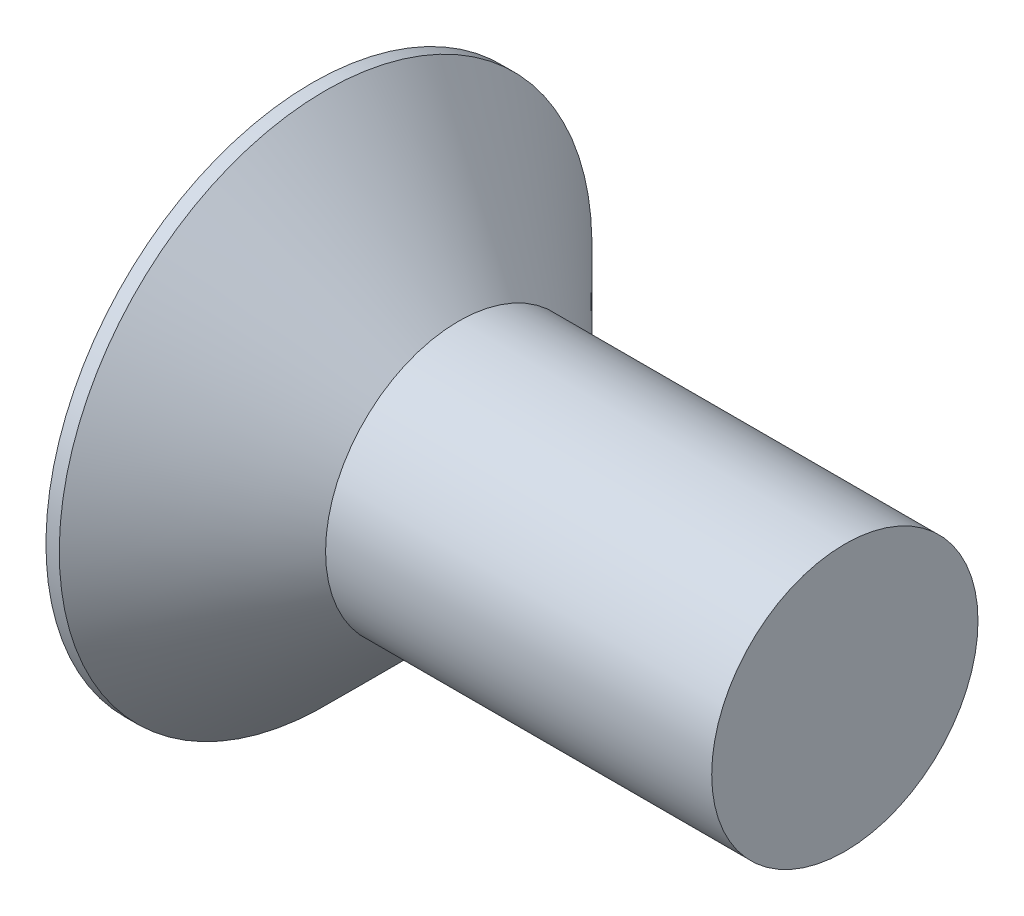
ISO-10303-21;
HEADER;
FILE_DESCRIPTION(('STEP AP214'),'2;1');
FILE_NAME('part.step','',(''),(''),'','','');
FILE_SCHEMA(('AUTOMOTIVE_DESIGN { 1 0 10303 214 1 1 1 1 }'));
ENDSEC;
DATA;
#1=APPLICATION_CONTEXT('core data for automotive mechanical design processes');
#2=APPLICATION_PROTOCOL_DEFINITION('international standard','automotive_design',2000,#1);
#3=PRODUCT_CONTEXT('',#1,'mechanical');
#4=PRODUCT('Part','Part','',(#3));
#5=PRODUCT_RELATED_PRODUCT_CATEGORY('part','',(#4));
#6=PRODUCT_DEFINITION_FORMATION('','',#4);
#7=PRODUCT_DEFINITION_CONTEXT('part definition',#1,'design');
#8=PRODUCT_DEFINITION('design','',#6,#7);
#9=PRODUCT_DEFINITION_SHAPE('','',#8);
#10=(LENGTH_UNIT() NAMED_UNIT(*) SI_UNIT(.MILLI.,.METRE.));
#11=(NAMED_UNIT(*) PLANE_ANGLE_UNIT() SI_UNIT($,.RADIAN.));
#12=(NAMED_UNIT(*) SI_UNIT($,.STERADIAN.) SOLID_ANGLE_UNIT());
#13=UNCERTAINTY_MEASURE_WITH_UNIT(LENGTH_MEASURE(1.E-05),#10,'distance_accuracy_value','');
#14=(GEOMETRIC_REPRESENTATION_CONTEXT(3) GLOBAL_UNCERTAINTY_ASSIGNED_CONTEXT((#13)) GLOBAL_UNIT_ASSIGNED_CONTEXT((#10,
#11,#12)) REPRESENTATION_CONTEXT('',''));
#15=CARTESIAN_POINT('',(0.,0.,0.));
#16=DIRECTION('',(0.,0.,1.));
#17=DIRECTION('',(1.,0.,0.));
#18=AXIS2_PLACEMENT_3D('',#15,#16,#17);
#19=CARTESIAN_POINT('',(0.,0.,0.));
#20=DIRECTION('',(-1.,0.,0.));
#21=DIRECTION('',(0.,-1.,0.));
#22=AXIS2_PLACEMENT_3D('',#19,#20,#21);
#23=PLANE('',#22);
#24=DIRECTION('',(0.,0.866025403784438,-0.5));
#25=VECTOR('',#24,1.);
#26=CARTESIAN_POINT('',(0.,0.,3.46410161513776));
#27=LINE('',#26,#25);
#28=CARTESIAN_POINT('',(0.,0.,3.46410161513776));
#29=VERTEX_POINT('',#28);
#30=CARTESIAN_POINT('',(0.,3.,1.73205080756888));
#31=VERTEX_POINT('',#30);
#32=EDGE_CURVE('E47',#29,#31,#27,.T.);
#33=ORIENTED_EDGE('',*,*,#32,.F.);
#34=DIRECTION('',(0.,0.866025403784438,0.5));
#35=VECTOR('',#34,1.);
#36=CARTESIAN_POINT('',(0.,-3.,1.73205080756888));
#37=LINE('',#36,#35);
#38=CARTESIAN_POINT('',(0.,-3.,1.73205080756888));
#39=VERTEX_POINT('',#38);
#40=EDGE_CURVE('E130',#39,#29,#37,.T.);
#41=ORIENTED_EDGE('',*,*,#40,.F.);
#42=DIRECTION('',(0.,0.,1.));
#43=VECTOR('',#42,1.);
#44=CARTESIAN_POINT('',(0.,-3.,-1.73205080756888));
#45=LINE('',#44,#43);
#46=CARTESIAN_POINT('',(0.,-3.,-1.73205080756888));
#47=VERTEX_POINT('',#46);
#48=EDGE_CURVE('E128',#47,#39,#45,.T.);
#49=ORIENTED_EDGE('',*,*,#48,.F.);
#50=DIRECTION('',(0.,-0.866025403784439,0.5));
#51=VECTOR('',#50,1.);
#52=CARTESIAN_POINT('',(0.,0.,-3.46410161513775));
#53=LINE('',#52,#51);
#54=CARTESIAN_POINT('',(0.,0.,-3.46410161513775));
#55=VERTEX_POINT('',#54);
#56=EDGE_CURVE('E95',#55,#47,#53,.T.);
#57=ORIENTED_EDGE('',*,*,#56,.F.);
#58=DIRECTION('',(0.,-0.866025403784439,-0.5));
#59=VECTOR('',#58,1.);
#60=CARTESIAN_POINT('',(0.,3.,-1.73205080756888));
#61=LINE('',#60,#59);
#62=CARTESIAN_POINT('',(0.,3.,-1.73205080756888));
#63=VERTEX_POINT('',#62);
#64=EDGE_CURVE('E124',#63,#55,#61,.T.);
#65=ORIENTED_EDGE('',*,*,#64,.F.);
#66=DIRECTION('',(0.,0.,-1.));
#67=VECTOR('',#66,1.);
#68=CARTESIAN_POINT('',(0.,3.,1.73205080756888));
#69=LINE('',#68,#67);
#70=EDGE_CURVE('E121',#31,#63,#69,.T.);
#71=ORIENTED_EDGE('',*,*,#70,.F.);
#72=EDGE_LOOP('',(#33,#41,#49,#57,#65,#71));
#73=FACE_BOUND('',#72,.T.);
#74=CARTESIAN_POINT('',(0.,0.,0.));
#75=DIRECTION('',(1.,0.,0.));
#76=DIRECTION('',(0.,1.,0.));
#77=AXIS2_PLACEMENT_3D('',#74,#75,#76);
#78=CIRCLE('',#77,10.);
#79=CARTESIAN_POINT('',(0.,10.,0.));
#80=VERTEX_POINT('',#79);
#81=EDGE_CURVE('E11',#80,#80,#78,.T.);
#82=ORIENTED_EDGE('',*,*,#81,.F.);
#83=EDGE_LOOP('',(#82));
#84=FACE_BOUND('',#83,.T.);
#85=ADVANCED_FACE('F33',(#73,#84),#23,.T.);
#86=CARTESIAN_POINT('',(20.,0.,0.));
#87=DIRECTION('',(1.,0.,0.));
#88=DIRECTION('',(0.,1.,0.));
#89=AXIS2_PLACEMENT_3D('',#86,#87,#88);
#90=CYLINDRICAL_SURFACE('',#89,10.);
#91=ORIENTED_EDGE('',*,*,#81,.T.);
#92=EDGE_LOOP('',(#91));
#93=FACE_BOUND('',#92,.T.);
#94=CARTESIAN_POINT('',(0.499999999999945,0.,0.));
#95=DIRECTION('',(1.,0.,0.));
#96=DIRECTION('',(0.,1.,0.));
#97=AXIS2_PLACEMENT_3D('',#94,#95,#96);
#98=CIRCLE('',#97,10.);
#99=CARTESIAN_POINT('',(0.499999999999943,10.,0.));
#100=VERTEX_POINT('',#99);
#101=EDGE_CURVE('E40',#100,#100,#98,.T.);
#102=ORIENTED_EDGE('',*,*,#101,.F.);
#103=EDGE_LOOP('',(#102));
#104=FACE_BOUND('',#103,.T.);
#105=ADVANCED_FACE('F150',(#93,#104),#90,.T.);
#106=CARTESIAN_POINT('',(5.5,0.,0.));
#107=DIRECTION('',(-1.,0.,0.));
#108=DIRECTION('',(0.,-1.,0.));
#109=AXIS2_PLACEMENT_3D('',#106,#107,#108);
#110=CONICAL_SURFACE('',#109,5.,0.785398163397443);
#111=ORIENTED_EDGE('',*,*,#101,.T.);
#112=EDGE_LOOP('',(#111));
#113=FACE_BOUND('',#112,.T.);
#114=CARTESIAN_POINT('',(5.5,0.,0.));
#115=DIRECTION('',(1.,0.,0.));
#116=DIRECTION('',(0.,1.,0.));
#117=AXIS2_PLACEMENT_3D('',#114,#115,#116);
#118=CIRCLE('',#117,5.);
#119=CARTESIAN_POINT('',(5.5,5.,0.));
#120=VERTEX_POINT('',#119);
#121=EDGE_CURVE('E142',#120,#120,#118,.T.);
#122=ORIENTED_EDGE('',*,*,#121,.F.);
#123=EDGE_LOOP('',(#122));
#124=FACE_BOUND('',#123,.T.);
#125=ADVANCED_FACE('F147',(#113,#124),#110,.T.);
#126=CARTESIAN_POINT('',(20.,0.,0.));
#127=DIRECTION('',(1.,0.,0.));
#128=DIRECTION('',(0.,1.,0.));
#129=AXIS2_PLACEMENT_3D('',#126,#127,#128);
#130=CYLINDRICAL_SURFACE('',#129,5.);
#131=ORIENTED_EDGE('',*,*,#121,.T.);
#132=EDGE_LOOP('',(#131));
#133=FACE_BOUND('',#132,.T.);
#134=CARTESIAN_POINT('',(20.,0.,0.));
#135=DIRECTION('',(1.,0.,0.));
#136=DIRECTION('',(0.,1.,0.));
#137=AXIS2_PLACEMENT_3D('',#134,#135,#136);
#138=CIRCLE('',#137,5.);
#139=CARTESIAN_POINT('',(20.,5.,0.));
#140=VERTEX_POINT('',#139);
#141=EDGE_CURVE('E134',#140,#140,#138,.T.);
#142=ORIENTED_EDGE('',*,*,#141,.F.);
#143=EDGE_LOOP('',(#142));
#144=FACE_BOUND('',#143,.T.);
#145=ADVANCED_FACE('F157',(#133,#144),#130,.T.);
#146=CARTESIAN_POINT('',(20.,5.,0.));
#147=DIRECTION('',(1.,0.,0.));
#148=DIRECTION('',(0.,1.,0.));
#149=AXIS2_PLACEMENT_3D('',#146,#147,#148);
#150=PLANE('',#149);
#151=ORIENTED_EDGE('',*,*,#141,.T.);
#152=EDGE_LOOP('',(#151));
#153=FACE_BOUND('',#152,.T.);
#154=ADVANCED_FACE('F163',(#153),#150,.T.);
#155=CARTESIAN_POINT('',(4.4,0.,3.46410161513776));
#156=DIRECTION('',(0.,0.5,0.866025403784438));
#157=DIRECTION('',(0.,-0.866025403784439,0.5));
#158=AXIS2_PLACEMENT_3D('',#155,#156,#157);
#159=PLANE('',#158);
#160=ORIENTED_EDGE('',*,*,#32,.T.);
#161=DIRECTION('',(-1.,0.,0.));
#162=VECTOR('',#161,1.);
#163=CARTESIAN_POINT('',(4.4,2.99999999999999,1.73205080756888));
#164=LINE('',#163,#162);
#165=CARTESIAN_POINT('',(4.4,2.99999999999999,1.73205080756888));
#166=VERTEX_POINT('',#165);
#167=EDGE_CURVE('E77',#166,#31,#164,.T.);
#168=ORIENTED_EDGE('',*,*,#167,.F.);
#169=DIRECTION('',(0.,0.866025403784438,-0.5));
#170=VECTOR('',#169,1.);
#171=CARTESIAN_POINT('',(4.4,0.,3.46410161513776));
#172=LINE('',#171,#170);
#173=CARTESIAN_POINT('',(4.4,0.,3.46410161513776));
#174=VERTEX_POINT('',#173);
#175=EDGE_CURVE('E132',#174,#166,#172,.T.);
#176=ORIENTED_EDGE('',*,*,#175,.F.);
#177=DIRECTION('',(-1.,0.,0.));
#178=VECTOR('',#177,1.);
#179=CARTESIAN_POINT('',(4.4,0.,3.46410161513776));
#180=LINE('',#179,#178);
#181=EDGE_CURVE('E55',#174,#29,#180,.T.);
#182=ORIENTED_EDGE('',*,*,#181,.T.);
#183=EDGE_LOOP('',(#160,#168,#176,#182));
#184=FACE_BOUND('',#183,.T.);
#185=ADVANCED_FACE('F167',(#184),#159,.F.);
#186=CARTESIAN_POINT('',(4.4,-3.00000000000001,1.73205080756888));
#187=DIRECTION('',(0.,-0.5,0.866025403784439));
#188=DIRECTION('',(0.,-0.866025403784438,-0.5));
#189=AXIS2_PLACEMENT_3D('',#186,#187,#188);
#190=PLANE('',#189);
#191=ORIENTED_EDGE('',*,*,#40,.T.);
#192=ORIENTED_EDGE('',*,*,#181,.F.);
#193=DIRECTION('',(0.,0.866025403784438,0.5));
#194=VECTOR('',#193,1.);
#195=CARTESIAN_POINT('',(4.4,-3.00000000000001,1.73205080756888));
#196=LINE('',#195,#194);
#197=CARTESIAN_POINT('',(4.4,-3.00000000000001,1.73205080756888));
#198=VERTEX_POINT('',#197);
#199=EDGE_CURVE('E107',#198,#174,#196,.T.);
#200=ORIENTED_EDGE('',*,*,#199,.F.);
#201=DIRECTION('',(-1.,0.,0.));
#202=VECTOR('',#201,1.);
#203=CARTESIAN_POINT('',(4.4,-3.00000000000001,1.73205080756888));
#204=LINE('',#203,#202);
#205=EDGE_CURVE('E99',#198,#39,#204,.T.);
#206=ORIENTED_EDGE('',*,*,#205,.T.);
#207=EDGE_LOOP('',(#191,#192,#200,#206));
#208=FACE_BOUND('',#207,.T.);
#209=ADVANCED_FACE('F171',(#208),#190,.F.);
#210=CARTESIAN_POINT('',(4.4,-3.00000000000001,-1.73205080756888));
#211=DIRECTION('',(0.,-1.,0.));
#212=DIRECTION('',(1.,0.,0.));
#213=AXIS2_PLACEMENT_3D('',#210,#211,#212);
#214=PLANE('',#213);
#215=ORIENTED_EDGE('',*,*,#48,.T.);
#216=ORIENTED_EDGE('',*,*,#205,.F.);
#217=DIRECTION('',(0.,0.,1.));
#218=VECTOR('',#217,1.);
#219=CARTESIAN_POINT('',(4.4,-3.00000000000001,-1.73205080756888));
#220=LINE('',#219,#218);
#221=CARTESIAN_POINT('',(4.4,-3.00000000000001,-1.73205080756888));
#222=VERTEX_POINT('',#221);
#223=EDGE_CURVE('E103',#222,#198,#220,.T.);
#224=ORIENTED_EDGE('',*,*,#223,.F.);
#225=DIRECTION('',(-1.,0.,0.));
#226=VECTOR('',#225,1.);
#227=CARTESIAN_POINT('',(4.4,-3.00000000000001,-1.73205080756888));
#228=LINE('',#227,#226);
#229=EDGE_CURVE('E88',#222,#47,#228,.T.);
#230=ORIENTED_EDGE('',*,*,#229,.T.);
#231=EDGE_LOOP('',(#215,#216,#224,#230));
#232=FACE_BOUND('',#231,.T.);
#233=ADVANCED_FACE('F104',(#232),#214,.F.);
#234=CARTESIAN_POINT('',(4.4,0.,-3.46410161513775));
#235=DIRECTION('',(0.,-0.5,-0.866025403784438));
#236=DIRECTION('',(0.,0.866025403784439,-0.5));
#237=AXIS2_PLACEMENT_3D('',#234,#235,#236);
#238=PLANE('',#237);
#239=ORIENTED_EDGE('',*,*,#56,.T.);
#240=ORIENTED_EDGE('',*,*,#229,.F.);
#241=DIRECTION('',(0.,-0.866025403784439,0.5));
#242=VECTOR('',#241,1.);
#243=CARTESIAN_POINT('',(4.4,0.,-3.46410161513775));
#244=LINE('',#243,#242);
#245=CARTESIAN_POINT('',(4.4,0.,-3.46410161513775));
#246=VERTEX_POINT('',#245);
#247=EDGE_CURVE('E92',#246,#222,#244,.T.);
#248=ORIENTED_EDGE('',*,*,#247,.F.);
#249=DIRECTION('',(-1.,0.,0.));
#250=VECTOR('',#249,1.);
#251=CARTESIAN_POINT('',(4.4,0.,-3.46410161513775));
#252=LINE('',#251,#250);
#253=EDGE_CURVE('E100',#246,#55,#252,.T.);
#254=ORIENTED_EDGE('',*,*,#253,.T.);
#255=EDGE_LOOP('',(#239,#240,#248,#254));
#256=FACE_BOUND('',#255,.T.);
#257=ADVANCED_FACE('F90',(#256),#238,.F.);
#258=CARTESIAN_POINT('',(4.4,2.99999999999999,-1.73205080756888));
#259=DIRECTION('',(0.,0.5,-0.866025403784439));
#260=DIRECTION('',(0.,0.866025403784439,0.5));
#261=AXIS2_PLACEMENT_3D('',#258,#259,#260);
#262=PLANE('',#261);
#263=ORIENTED_EDGE('',*,*,#64,.T.);
#264=ORIENTED_EDGE('',*,*,#253,.F.);
#265=DIRECTION('',(0.,-0.866025403784439,-0.5));
#266=VECTOR('',#265,1.);
#267=CARTESIAN_POINT('',(4.4,2.99999999999999,-1.73205080756888));
#268=LINE('',#267,#266);
#269=CARTESIAN_POINT('',(4.4,2.99999999999999,-1.73205080756888));
#270=VERTEX_POINT('',#269);
#271=EDGE_CURVE('E113',#270,#246,#268,.T.);
#272=ORIENTED_EDGE('',*,*,#271,.F.);
#273=DIRECTION('',(-1.,0.,0.));
#274=VECTOR('',#273,1.);
#275=CARTESIAN_POINT('',(4.4,2.99999999999999,-1.73205080756888));
#276=LINE('',#275,#274);
#277=EDGE_CURVE('E137',#270,#63,#276,.T.);
#278=ORIENTED_EDGE('',*,*,#277,.T.);
#279=EDGE_LOOP('',(#263,#264,#272,#278));
#280=FACE_BOUND('',#279,.T.);
#281=ADVANCED_FACE('F175',(#280),#262,.F.);
#282=CARTESIAN_POINT('',(4.4,2.99999999999999,1.73205080756888));
#283=DIRECTION('',(0.,1.,0.));
#284=DIRECTION('',(-1.,0.,0.));
#285=AXIS2_PLACEMENT_3D('',#282,#283,#284);
#286=PLANE('',#285);
#287=ORIENTED_EDGE('',*,*,#70,.T.);
#288=ORIENTED_EDGE('',*,*,#277,.F.);
#289=DIRECTION('',(0.,0.,-1.));
#290=VECTOR('',#289,1.);
#291=CARTESIAN_POINT('',(4.4,2.99999999999999,1.73205080756888));
#292=LINE('',#291,#290);
#293=EDGE_CURVE('E115',#166,#270,#292,.T.);
#294=ORIENTED_EDGE('',*,*,#293,.F.);
#295=ORIENTED_EDGE('',*,*,#167,.T.);
#296=EDGE_LOOP('',(#287,#288,#294,#295));
#297=FACE_BOUND('',#296,.T.);
#298=ADVANCED_FACE('F172',(#297),#286,.F.);
#299=CARTESIAN_POINT('',(4.4,0.,0.));
#300=DIRECTION('',(-1.,0.,0.));
#301=DIRECTION('',(0.,-1.,0.));
#302=AXIS2_PLACEMENT_3D('',#299,#300,#301);
#303=PLANE('',#302);
#304=ORIENTED_EDGE('',*,*,#175,.T.);
#305=ORIENTED_EDGE('',*,*,#293,.T.);
#306=ORIENTED_EDGE('',*,*,#271,.T.);
#307=ORIENTED_EDGE('',*,*,#247,.T.);
#308=ORIENTED_EDGE('',*,*,#223,.T.);
#309=ORIENTED_EDGE('',*,*,#199,.T.);
#310=EDGE_LOOP('',(#304,#305,#306,#307,#308,#309));
#311=FACE_BOUND('',#310,.T.);
#312=ADVANCED_FACE('F110',(#311),#303,.T.);
#313=CLOSED_SHELL('',(#85,#105,#125,#145,#154,#185,#209,#233,#257,#281,#298,#312));
#314=MANIFOLD_SOLID_BREP('B2',#313);
#315=ADVANCED_BREP_SHAPE_REPRESENTATION('',(#18,#314),#14);
#316=SHAPE_DEFINITION_REPRESENTATION(#9,#315);
ENDSEC;
END-ISO-10303-21;
